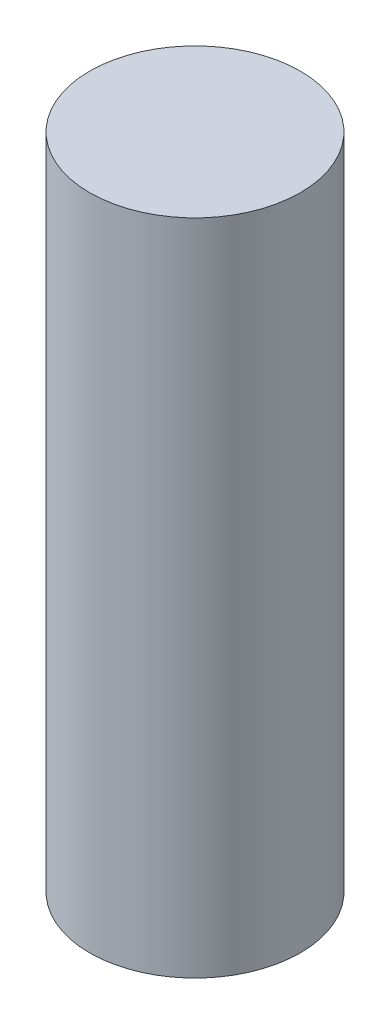
ISO-10303-21;
HEADER;
FILE_DESCRIPTION(('STEP AP214'),'2;1');
FILE_NAME('part.step','',(''),(''),'','','');
FILE_SCHEMA(('AUTOMOTIVE_DESIGN { 1 0 10303 214 1 1 1 1 }'));
ENDSEC;
DATA;
#1=APPLICATION_CONTEXT('core data for automotive mechanical design processes');
#2=APPLICATION_PROTOCOL_DEFINITION('international standard','automotive_design',2000,#1);
#3=PRODUCT_CONTEXT('',#1,'mechanical');
#4=PRODUCT('Part','Part','',(#3));
#5=PRODUCT_RELATED_PRODUCT_CATEGORY('part','',(#4));
#6=PRODUCT_DEFINITION_FORMATION('','',#4);
#7=PRODUCT_DEFINITION_CONTEXT('part definition',#1,'design');
#8=PRODUCT_DEFINITION('design','',#6,#7);
#9=PRODUCT_DEFINITION_SHAPE('','',#8);
#10=(LENGTH_UNIT() NAMED_UNIT(*) SI_UNIT(.MILLI.,.METRE.));
#11=(NAMED_UNIT(*) PLANE_ANGLE_UNIT() SI_UNIT($,.RADIAN.));
#12=(NAMED_UNIT(*) SI_UNIT($,.STERADIAN.) SOLID_ANGLE_UNIT());
#13=UNCERTAINTY_MEASURE_WITH_UNIT(LENGTH_MEASURE(1.E-05),#10,'distance_accuracy_value','');
#14=(GEOMETRIC_REPRESENTATION_CONTEXT(3) GLOBAL_UNCERTAINTY_ASSIGNED_CONTEXT((#13)) GLOBAL_UNIT_ASSIGNED_CONTEXT((#10,
#11,#12)) REPRESENTATION_CONTEXT('',''));
#15=CARTESIAN_POINT('',(0.,0.,0.));
#16=DIRECTION('',(0.,0.,1.));
#17=DIRECTION('',(1.,0.,0.));
#18=AXIS2_PLACEMENT_3D('',#15,#16,#17);
#19=CARTESIAN_POINT('',(0.,25.,0.));
#20=DIRECTION('',(0.,-1.,0.));
#21=DIRECTION('',(0.,0.,-1.));
#22=AXIS2_PLACEMENT_3D('',#19,#20,#21);
#23=CYLINDRICAL_SURFACE('',#22,4.);
#24=CARTESIAN_POINT('',(0.,25.,0.));
#25=DIRECTION('',(0.,1.,0.));
#26=DIRECTION('',(0.,0.,1.));
#27=AXIS2_PLACEMENT_3D('',#24,#25,#26);
#28=CIRCLE('',#27,4.);
#29=CARTESIAN_POINT('',(0.,25.,4.));
#30=VERTEX_POINT('',#29);
#31=EDGE_CURVE('E10',#30,#30,#28,.T.);
#32=ORIENTED_EDGE('',*,*,#31,.F.);
#33=EDGE_LOOP('',(#32));
#34=FACE_BOUND('',#33,.T.);
#35=CARTESIAN_POINT('',(0.,0.,0.));
#36=DIRECTION('',(0.,1.,0.));
#37=DIRECTION('',(0.,0.,1.));
#38=AXIS2_PLACEMENT_3D('',#35,#36,#37);
#39=CIRCLE('',#38,4.);
#40=CARTESIAN_POINT('',(0.,0.,4.));
#41=VERTEX_POINT('',#40);
#42=EDGE_CURVE('E40',#41,#41,#39,.T.);
#43=ORIENTED_EDGE('',*,*,#42,.T.);
#44=EDGE_LOOP('',(#43));
#45=FACE_BOUND('',#44,.T.);
#46=ADVANCED_FACE('F37',(#34,#45),#23,.T.);
#47=CARTESIAN_POINT('',(0.,25.,0.));
#48=DIRECTION('',(0.,1.,0.));
#49=DIRECTION('',(0.,0.,1.));
#50=AXIS2_PLACEMENT_3D('',#47,#48,#49);
#51=PLANE('',#50);
#52=ORIENTED_EDGE('',*,*,#31,.T.);
#53=EDGE_LOOP('',(#52));
#54=FACE_BOUND('',#53,.T.);
#55=ADVANCED_FACE('F52',(#54),#51,.T.);
#56=CARTESIAN_POINT('',(0.,0.,0.));
#57=DIRECTION('',(0.,1.,0.));
#58=DIRECTION('',(0.,0.,1.));
#59=AXIS2_PLACEMENT_3D('',#56,#57,#58);
#60=PLANE('',#59);
#61=ORIENTED_EDGE('',*,*,#42,.F.);
#62=EDGE_LOOP('',(#61));
#63=FACE_BOUND('',#62,.T.);
#64=ADVANCED_FACE('F50',(#63),#60,.F.);
#65=CLOSED_SHELL('',(#46,#55,#64));
#66=MANIFOLD_SOLID_BREP('B2',#65);
#67=ADVANCED_BREP_SHAPE_REPRESENTATION('',(#18,#66),#14);
#68=SHAPE_DEFINITION_REPRESENTATION(#9,#67);
ENDSEC;
END-ISO-10303-21;
